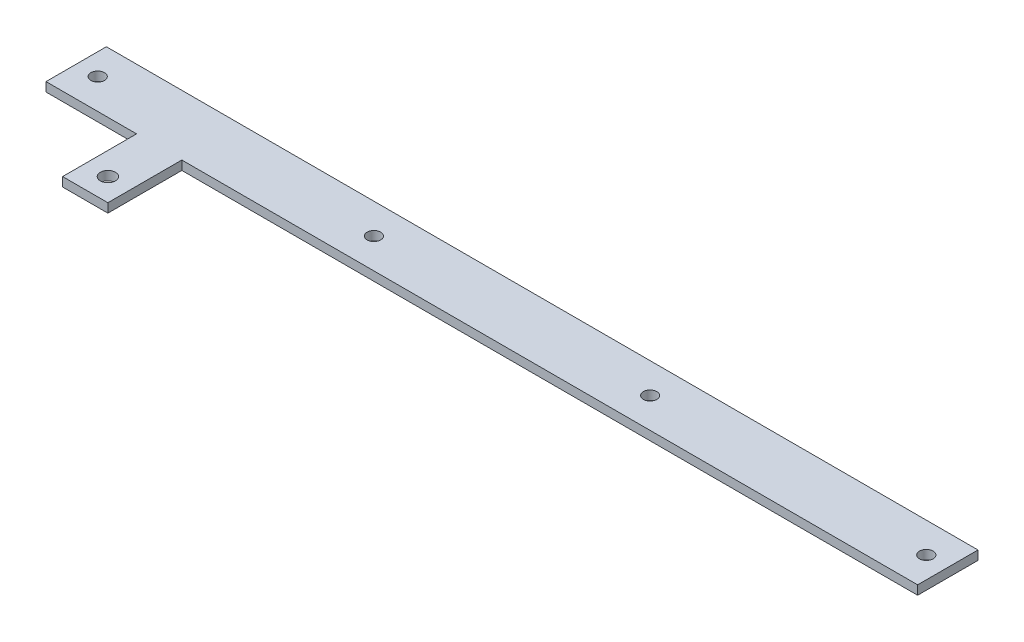
ISO-10303-21;
HEADER;
FILE_DESCRIPTION(('STEP AP214'),'2;1');
FILE_NAME('part.step','',(''),(''),'','','');
FILE_SCHEMA(('AUTOMOTIVE_DESIGN { 1 0 10303 214 1 1 1 1 }'));
ENDSEC;
DATA;
#1=APPLICATION_CONTEXT('core data for automotive mechanical design processes');
#2=APPLICATION_PROTOCOL_DEFINITION('international standard','automotive_design',2000,#1);
#3=PRODUCT_CONTEXT('',#1,'mechanical');
#4=PRODUCT('Part','Part','',(#3));
#5=PRODUCT_RELATED_PRODUCT_CATEGORY('part','',(#4));
#6=PRODUCT_DEFINITION_FORMATION('','',#4);
#7=PRODUCT_DEFINITION_CONTEXT('part definition',#1,'design');
#8=PRODUCT_DEFINITION('design','',#6,#7);
#9=PRODUCT_DEFINITION_SHAPE('','',#8);
#10=(LENGTH_UNIT() NAMED_UNIT(*) SI_UNIT(.MILLI.,.METRE.));
#11=(NAMED_UNIT(*) PLANE_ANGLE_UNIT() SI_UNIT($,.RADIAN.));
#12=(NAMED_UNIT(*) SI_UNIT($,.STERADIAN.) SOLID_ANGLE_UNIT());
#13=UNCERTAINTY_MEASURE_WITH_UNIT(LENGTH_MEASURE(1.E-05),#10,'distance_accuracy_value','');
#14=(GEOMETRIC_REPRESENTATION_CONTEXT(3) GLOBAL_UNCERTAINTY_ASSIGNED_CONTEXT((#13)) GLOBAL_UNIT_ASSIGNED_CONTEXT((#10,
#11,#12)) REPRESENTATION_CONTEXT('',''));
#15=CARTESIAN_POINT('',(0.,0.,0.));
#16=DIRECTION('',(0.,0.,1.));
#17=DIRECTION('',(1.,0.,0.));
#18=AXIS2_PLACEMENT_3D('',#15,#16,#17);
#19=CARTESIAN_POINT('',(-577.5,12.,40.));
#20=DIRECTION('',(0.,0.,-1.));
#21=DIRECTION('',(-1.,0.,0.));
#22=AXIS2_PLACEMENT_3D('',#19,#20,#21);
#23=PLANE('',#22);
#24=DIRECTION('',(0.,1.,0.));
#25=VECTOR('',#24,1.);
#26=CARTESIAN_POINT('',(-397.5,0.,40.));
#27=LINE('',#26,#25);
#28=CARTESIAN_POINT('',(-397.5,0.,40.));
#29=VERTEX_POINT('',#28);
#30=CARTESIAN_POINT('',(-397.5,12.,40.));
#31=VERTEX_POINT('',#30);
#32=EDGE_CURVE('E144',#29,#31,#27,.T.);
#33=ORIENTED_EDGE('',*,*,#32,.F.);
#34=DIRECTION('',(1.,0.,0.));
#35=VECTOR('',#34,1.);
#36=CARTESIAN_POINT('',(-577.5,0.,40.));
#37=LINE('',#36,#35);
#38=CARTESIAN_POINT('',(577.5,0.,40.));
#39=VERTEX_POINT('',#38);
#40=EDGE_CURVE('E79',#29,#39,#37,.T.);
#41=ORIENTED_EDGE('',*,*,#40,.T.);
#42=DIRECTION('',(0.,-1.,0.));
#43=VECTOR('',#42,1.);
#44=CARTESIAN_POINT('',(577.5,12.,40.));
#45=LINE('',#44,#43);
#46=CARTESIAN_POINT('',(577.5,12.,40.));
#47=VERTEX_POINT('',#46);
#48=EDGE_CURVE('E168',#47,#39,#45,.T.);
#49=ORIENTED_EDGE('',*,*,#48,.F.);
#50=DIRECTION('',(1.,0.,0.));
#51=VECTOR('',#50,1.);
#52=CARTESIAN_POINT('',(-577.5,12.,40.));
#53=LINE('',#52,#51);
#54=EDGE_CURVE('E57',#31,#47,#53,.T.);
#55=ORIENTED_EDGE('',*,*,#54,.F.);
#56=EDGE_LOOP('',(#33,#41,#49,#55));
#57=FACE_BOUND('',#56,.T.);
#58=ADVANCED_FACE('F33',(#57),#23,.F.);
#59=CARTESIAN_POINT('',(549.,0.,0.));
#60=DIRECTION('',(0.,1.,0.));
#61=DIRECTION('',(0.,0.,1.));
#62=AXIS2_PLACEMENT_3D('',#59,#60,#61);
#63=CYLINDRICAL_SURFACE('',#62,9.00000000000004);
#64=CARTESIAN_POINT('',(549.,0.,0.));
#65=DIRECTION('',(0.,1.,0.));
#66=DIRECTION('',(0.,0.,1.));
#67=AXIS2_PLACEMENT_3D('',#64,#65,#66);
#68=CIRCLE('',#67,9.00000000000004);
#69=CARTESIAN_POINT('',(549.,0.,9.00000000000004));
#70=VERTEX_POINT('',#69);
#71=EDGE_CURVE('E41',#70,#70,#68,.T.);
#72=ORIENTED_EDGE('',*,*,#71,.F.);
#73=EDGE_LOOP('',(#72));
#74=FACE_BOUND('',#73,.T.);
#75=CARTESIAN_POINT('',(549.,12.,0.));
#76=DIRECTION('',(0.,-1.,0.));
#77=DIRECTION('',(0.,0.,-1.));
#78=AXIS2_PLACEMENT_3D('',#75,#76,#77);
#79=CIRCLE('',#78,9.00000000000004);
#80=CARTESIAN_POINT('',(549.,12.,-9.00000000000003));
#81=VERTEX_POINT('',#80);
#82=EDGE_CURVE('E11',#81,#81,#79,.T.);
#83=ORIENTED_EDGE('',*,*,#82,.F.);
#84=EDGE_LOOP('',(#83));
#85=FACE_BOUND('',#84,.T.);
#86=ADVANCED_FACE('F35',(#74,#85),#63,.F.);
#87=CARTESIAN_POINT('',(183.,0.,0.));
#88=DIRECTION('',(0.,1.,0.));
#89=DIRECTION('',(0.,0.,1.));
#90=AXIS2_PLACEMENT_3D('',#87,#88,#89);
#91=CYLINDRICAL_SURFACE('',#90,9.00000000000004);
#92=CARTESIAN_POINT('',(183.,0.,0.));
#93=DIRECTION('',(0.,1.,0.));
#94=DIRECTION('',(0.,0.,1.));
#95=AXIS2_PLACEMENT_3D('',#92,#93,#94);
#96=CIRCLE('',#95,9.00000000000004);
#97=CARTESIAN_POINT('',(183.,0.,9.00000000000004));
#98=VERTEX_POINT('',#97);
#99=EDGE_CURVE('E185',#98,#98,#96,.T.);
#100=ORIENTED_EDGE('',*,*,#99,.F.);
#101=EDGE_LOOP('',(#100));
#102=FACE_BOUND('',#101,.T.);
#103=CARTESIAN_POINT('',(183.,12.,0.));
#104=DIRECTION('',(0.,-1.,0.));
#105=DIRECTION('',(0.,0.,-1.));
#106=AXIS2_PLACEMENT_3D('',#103,#104,#105);
#107=CIRCLE('',#106,9.00000000000004);
#108=CARTESIAN_POINT('',(183.,12.,-9.00000000000003));
#109=VERTEX_POINT('',#108);
#110=EDGE_CURVE('E188',#109,#109,#107,.T.);
#111=ORIENTED_EDGE('',*,*,#110,.F.);
#112=EDGE_LOOP('',(#111));
#113=FACE_BOUND('',#112,.T.);
#114=ADVANCED_FACE('F197',(#102,#113),#91,.F.);
#115=CARTESIAN_POINT('',(577.5,12.,40.));
#116=DIRECTION('',(-1.,0.,0.));
#117=DIRECTION('',(0.,0.,1.));
#118=AXIS2_PLACEMENT_3D('',#115,#116,#117);
#119=PLANE('',#118);
#120=DIRECTION('',(0.,0.,-1.));
#121=VECTOR('',#120,1.);
#122=CARTESIAN_POINT('',(577.5,0.,40.));
#123=LINE('',#122,#121);
#124=CARTESIAN_POINT('',(577.5,0.,-40.));
#125=VERTEX_POINT('',#124);
#126=EDGE_CURVE('E158',#39,#125,#123,.T.);
#127=ORIENTED_EDGE('',*,*,#126,.T.);
#128=DIRECTION('',(0.,-1.,0.));
#129=VECTOR('',#128,1.);
#130=CARTESIAN_POINT('',(577.5,12.,-40.));
#131=LINE('',#130,#129);
#132=CARTESIAN_POINT('',(577.5,12.,-40.));
#133=VERTEX_POINT('',#132);
#134=EDGE_CURVE('E183',#133,#125,#131,.T.);
#135=ORIENTED_EDGE('',*,*,#134,.F.);
#136=DIRECTION('',(0.,0.,-1.));
#137=VECTOR('',#136,1.);
#138=CARTESIAN_POINT('',(577.5,12.,40.));
#139=LINE('',#138,#137);
#140=EDGE_CURVE('E159',#47,#133,#139,.T.);
#141=ORIENTED_EDGE('',*,*,#140,.F.);
#142=ORIENTED_EDGE('',*,*,#48,.T.);
#143=EDGE_LOOP('',(#127,#135,#141,#142));
#144=FACE_BOUND('',#143,.T.);
#145=ADVANCED_FACE('F242',(#144),#119,.F.);
#146=CARTESIAN_POINT('',(-577.5,12.,-40.));
#147=DIRECTION('',(0.,0.,1.));
#148=DIRECTION('',(1.,0.,0.));
#149=AXIS2_PLACEMENT_3D('',#146,#147,#148);
#150=PLANE('',#149);
#151=DIRECTION('',(-1.,0.,0.));
#152=VECTOR('',#151,1.);
#153=CARTESIAN_POINT('',(-577.5,0.,-40.));
#154=LINE('',#153,#152);
#155=CARTESIAN_POINT('',(-577.5,0.,-40.));
#156=VERTEX_POINT('',#155);
#157=EDGE_CURVE('E171',#125,#156,#154,.T.);
#158=ORIENTED_EDGE('',*,*,#157,.T.);
#159=DIRECTION('',(0.,-1.,0.));
#160=VECTOR('',#159,1.);
#161=CARTESIAN_POINT('',(-577.5,12.,-40.));
#162=LINE('',#161,#160);
#163=CARTESIAN_POINT('',(-577.5,12.,-40.));
#164=VERTEX_POINT('',#163);
#165=EDGE_CURVE('E180',#164,#156,#162,.T.);
#166=ORIENTED_EDGE('',*,*,#165,.F.);
#167=DIRECTION('',(-1.,0.,0.));
#168=VECTOR('',#167,1.);
#169=CARTESIAN_POINT('',(-577.5,12.,-40.));
#170=LINE('',#169,#168);
#171=EDGE_CURVE('E87',#133,#164,#170,.T.);
#172=ORIENTED_EDGE('',*,*,#171,.F.);
#173=ORIENTED_EDGE('',*,*,#134,.T.);
#174=EDGE_LOOP('',(#158,#166,#172,#173));
#175=FACE_BOUND('',#174,.T.);
#176=ADVANCED_FACE('F233',(#175),#150,.F.);
#177=CARTESIAN_POINT('',(-577.5,12.,40.));
#178=DIRECTION('',(1.,0.,0.));
#179=DIRECTION('',(0.,0.,-1.));
#180=AXIS2_PLACEMENT_3D('',#177,#178,#179);
#181=PLANE('',#180);
#182=DIRECTION('',(0.,0.,1.));
#183=VECTOR('',#182,1.);
#184=CARTESIAN_POINT('',(-577.5,0.,40.));
#185=LINE('',#184,#183);
#186=CARTESIAN_POINT('',(-577.5,0.,40.));
#187=VERTEX_POINT('',#186);
#188=EDGE_CURVE('E173',#156,#187,#185,.T.);
#189=ORIENTED_EDGE('',*,*,#188,.T.);
#190=DIRECTION('',(0.,-1.,0.));
#191=VECTOR('',#190,1.);
#192=CARTESIAN_POINT('',(-577.5,12.,40.));
#193=LINE('',#192,#191);
#194=CARTESIAN_POINT('',(-577.5,12.,40.));
#195=VERTEX_POINT('',#194);
#196=EDGE_CURVE('E177',#195,#187,#193,.T.);
#197=ORIENTED_EDGE('',*,*,#196,.F.);
#198=DIRECTION('',(0.,0.,1.));
#199=VECTOR('',#198,1.);
#200=CARTESIAN_POINT('',(-577.5,12.,40.));
#201=LINE('',#200,#199);
#202=EDGE_CURVE('E163',#164,#195,#201,.T.);
#203=ORIENTED_EDGE('',*,*,#202,.F.);
#204=ORIENTED_EDGE('',*,*,#165,.T.);
#205=EDGE_LOOP('',(#189,#197,#203,#204));
#206=FACE_BOUND('',#205,.T.);
#207=ADVANCED_FACE('F228',(#206),#181,.F.);
#208=CARTESIAN_POINT('',(-457.5,0.,40.));
#209=VERTEX_POINT('',#208);
#210=EDGE_CURVE('E161',#187,#209,#37,.T.);
#211=ORIENTED_EDGE('',*,*,#210,.T.);
#212=DIRECTION('',(0.,1.,0.));
#213=VECTOR('',#212,1.);
#214=CARTESIAN_POINT('',(-457.5,0.,40.));
#215=LINE('',#214,#213);
#216=CARTESIAN_POINT('',(-457.5,12.,40.));
#217=VERTEX_POINT('',#216);
#218=EDGE_CURVE('E130',#209,#217,#215,.T.);
#219=ORIENTED_EDGE('',*,*,#218,.T.);
#220=EDGE_CURVE('E165',#195,#217,#53,.T.);
#221=ORIENTED_EDGE('',*,*,#220,.F.);
#222=ORIENTED_EDGE('',*,*,#196,.T.);
#223=EDGE_LOOP('',(#211,#219,#221,#222));
#224=FACE_BOUND('',#223,.T.);
#225=ADVANCED_FACE('F203',(#224),#23,.F.);
#226=CARTESIAN_POINT('',(0.,12.,0.));
#227=DIRECTION('',(0.,-1.,0.));
#228=DIRECTION('',(0.,0.,-1.));
#229=AXIS2_PLACEMENT_3D('',#226,#227,#228);
#230=PLANE('',#229);
#231=CARTESIAN_POINT('',(-183.,12.,0.));
#232=DIRECTION('',(0.,-1.,0.));
#233=DIRECTION('',(0.,0.,-1.));
#234=AXIS2_PLACEMENT_3D('',#231,#232,#233);
#235=CIRCLE('',#234,9.00000000000004);
#236=CARTESIAN_POINT('',(-183.,12.,-9.00000000000003));
#237=VERTEX_POINT('',#236);
#238=EDGE_CURVE('E149',#237,#237,#235,.T.);
#239=ORIENTED_EDGE('',*,*,#238,.T.);
#240=EDGE_LOOP('',(#239));
#241=FACE_BOUND('',#240,.T.);
#242=CARTESIAN_POINT('',(-549.,12.,0.));
#243=DIRECTION('',(0.,-1.,0.));
#244=DIRECTION('',(0.,0.,-1.));
#245=AXIS2_PLACEMENT_3D('',#242,#243,#244);
#246=CIRCLE('',#245,9.00000000000004);
#247=CARTESIAN_POINT('',(-549.,12.,-9.00000000000003));
#248=VERTEX_POINT('',#247);
#249=EDGE_CURVE('E155',#248,#248,#246,.T.);
#250=ORIENTED_EDGE('',*,*,#249,.T.);
#251=EDGE_LOOP('',(#250));
#252=FACE_BOUND('',#251,.T.);
#253=ORIENTED_EDGE('',*,*,#140,.T.);
#254=ORIENTED_EDGE('',*,*,#171,.T.);
#255=ORIENTED_EDGE('',*,*,#202,.T.);
#256=ORIENTED_EDGE('',*,*,#220,.T.);
#257=DIRECTION('',(0.,0.,1.));
#258=VECTOR('',#257,1.);
#259=CARTESIAN_POINT('',(-457.5,12.,40.));
#260=LINE('',#259,#258);
#261=CARTESIAN_POINT('',(-457.5,12.,138.));
#262=VERTEX_POINT('',#261);
#263=EDGE_CURVE('E48',#217,#262,#260,.T.);
#264=ORIENTED_EDGE('',*,*,#263,.T.);
#265=DIRECTION('',(1.,0.,0.));
#266=VECTOR('',#265,1.);
#267=CARTESIAN_POINT('',(-457.5,12.,138.));
#268=LINE('',#267,#266);
#269=CARTESIAN_POINT('',(-397.5,12.,138.));
#270=VERTEX_POINT('',#269);
#271=EDGE_CURVE('E114',#262,#270,#268,.T.);
#272=ORIENTED_EDGE('',*,*,#271,.T.);
#273=DIRECTION('',(0.,0.,-1.));
#274=VECTOR('',#273,1.);
#275=CARTESIAN_POINT('',(-397.5,12.,40.));
#276=LINE('',#275,#274);
#277=EDGE_CURVE('E131',#270,#31,#276,.T.);
#278=ORIENTED_EDGE('',*,*,#277,.T.);
#279=ORIENTED_EDGE('',*,*,#54,.T.);
#280=EDGE_LOOP('',(#253,#254,#255,#256,#264,#272,#278,#279));
#281=FACE_BOUND('',#280,.T.);
#282=ORIENTED_EDGE('',*,*,#110,.T.);
#283=EDGE_LOOP('',(#282));
#284=FACE_BOUND('',#283,.T.);
#285=ORIENTED_EDGE('',*,*,#82,.T.);
#286=EDGE_LOOP('',(#285));
#287=FACE_BOUND('',#286,.T.);
#288=CARTESIAN_POINT('',(-427.5,12.,108.));
#289=DIRECTION('',(0.,1.,0.));
#290=DIRECTION('',(0.,0.,1.));
#291=AXIS2_PLACEMENT_3D('',#288,#289,#290);
#292=CIRCLE('',#291,9.99999999999998);
#293=CARTESIAN_POINT('',(-427.5,12.,118.));
#294=VERTEX_POINT('',#293);
#295=EDGE_CURVE('E135',#294,#294,#292,.T.);
#296=ORIENTED_EDGE('',*,*,#295,.F.);
#297=EDGE_LOOP('',(#296));
#298=FACE_BOUND('',#297,.T.);
#299=ADVANCED_FACE('F200',(#241,#252,#281,#284,#287,#298),#230,.F.);
#300=CARTESIAN_POINT('',(0.,0.,0.));
#301=DIRECTION('',(0.,-1.,0.));
#302=DIRECTION('',(0.,0.,-1.));
#303=AXIS2_PLACEMENT_3D('',#300,#301,#302);
#304=PLANE('',#303);
#305=CARTESIAN_POINT('',(-183.,0.,0.));
#306=DIRECTION('',(0.,1.,0.));
#307=DIRECTION('',(0.,0.,1.));
#308=AXIS2_PLACEMENT_3D('',#305,#306,#307);
#309=CIRCLE('',#308,9.00000000000004);
#310=CARTESIAN_POINT('',(-183.,0.,9.00000000000004));
#311=VERTEX_POINT('',#310);
#312=EDGE_CURVE('E143',#311,#311,#309,.T.);
#313=ORIENTED_EDGE('',*,*,#312,.T.);
#314=EDGE_LOOP('',(#313));
#315=FACE_BOUND('',#314,.T.);
#316=CARTESIAN_POINT('',(-549.,0.,0.));
#317=DIRECTION('',(0.,1.,0.));
#318=DIRECTION('',(0.,0.,1.));
#319=AXIS2_PLACEMENT_3D('',#316,#317,#318);
#320=CIRCLE('',#319,9.00000000000004);
#321=CARTESIAN_POINT('',(-549.,0.,9.00000000000004));
#322=VERTEX_POINT('',#321);
#323=EDGE_CURVE('E152',#322,#322,#320,.T.);
#324=ORIENTED_EDGE('',*,*,#323,.T.);
#325=EDGE_LOOP('',(#324));
#326=FACE_BOUND('',#325,.T.);
#327=ORIENTED_EDGE('',*,*,#126,.F.);
#328=ORIENTED_EDGE('',*,*,#40,.F.);
#329=DIRECTION('',(0.,0.,-1.));
#330=VECTOR('',#329,1.);
#331=CARTESIAN_POINT('',(-397.5,0.,40.));
#332=LINE('',#331,#330);
#333=CARTESIAN_POINT('',(-397.5,0.,138.));
#334=VERTEX_POINT('',#333);
#335=EDGE_CURVE('E117',#334,#29,#332,.T.);
#336=ORIENTED_EDGE('',*,*,#335,.F.);
#337=DIRECTION('',(1.,0.,0.));
#338=VECTOR('',#337,1.);
#339=CARTESIAN_POINT('',(-457.5,0.,138.));
#340=LINE('',#339,#338);
#341=CARTESIAN_POINT('',(-457.5,0.,138.));
#342=VERTEX_POINT('',#341);
#343=EDGE_CURVE('E112',#342,#334,#340,.T.);
#344=ORIENTED_EDGE('',*,*,#343,.F.);
#345=DIRECTION('',(0.,0.,1.));
#346=VECTOR('',#345,1.);
#347=CARTESIAN_POINT('',(-457.5,0.,40.));
#348=LINE('',#347,#346);
#349=EDGE_CURVE('E126',#209,#342,#348,.T.);
#350=ORIENTED_EDGE('',*,*,#349,.F.);
#351=ORIENTED_EDGE('',*,*,#210,.F.);
#352=ORIENTED_EDGE('',*,*,#188,.F.);
#353=ORIENTED_EDGE('',*,*,#157,.F.);
#354=EDGE_LOOP('',(#327,#328,#336,#344,#350,#351,#352,#353));
#355=FACE_BOUND('',#354,.T.);
#356=ORIENTED_EDGE('',*,*,#99,.T.);
#357=EDGE_LOOP('',(#356));
#358=FACE_BOUND('',#357,.T.);
#359=ORIENTED_EDGE('',*,*,#71,.T.);
#360=EDGE_LOOP('',(#359));
#361=FACE_BOUND('',#360,.T.);
#362=CARTESIAN_POINT('',(-427.5,0.,108.));
#363=DIRECTION('',(0.,1.,0.));
#364=DIRECTION('',(0.,0.,1.));
#365=AXIS2_PLACEMENT_3D('',#362,#363,#364);
#366=CIRCLE('',#365,9.99999999999998);
#367=CARTESIAN_POINT('',(-427.5,0.,118.));
#368=VERTEX_POINT('',#367);
#369=EDGE_CURVE('E140',#368,#368,#366,.T.);
#370=ORIENTED_EDGE('',*,*,#369,.T.);
#371=EDGE_LOOP('',(#370));
#372=FACE_BOUND('',#371,.T.);
#373=ADVANCED_FACE('F123',(#315,#326,#355,#358,#361,#372),#304,.T.);
#374=CARTESIAN_POINT('',(-549.,0.,0.));
#375=DIRECTION('',(0.,1.,0.));
#376=DIRECTION('',(0.,0.,1.));
#377=AXIS2_PLACEMENT_3D('',#374,#375,#376);
#378=CYLINDRICAL_SURFACE('',#377,9.00000000000004);
#379=ORIENTED_EDGE('',*,*,#323,.F.);
#380=EDGE_LOOP('',(#379));
#381=FACE_BOUND('',#380,.T.);
#382=ORIENTED_EDGE('',*,*,#249,.F.);
#383=EDGE_LOOP('',(#382));
#384=FACE_BOUND('',#383,.T.);
#385=ADVANCED_FACE('F271',(#381,#384),#378,.F.);
#386=CARTESIAN_POINT('',(-183.,0.,0.));
#387=DIRECTION('',(0.,1.,0.));
#388=DIRECTION('',(0.,0.,1.));
#389=AXIS2_PLACEMENT_3D('',#386,#387,#388);
#390=CYLINDRICAL_SURFACE('',#389,9.00000000000004);
#391=ORIENTED_EDGE('',*,*,#312,.F.);
#392=EDGE_LOOP('',(#391));
#393=FACE_BOUND('',#392,.T.);
#394=ORIENTED_EDGE('',*,*,#238,.F.);
#395=EDGE_LOOP('',(#394));
#396=FACE_BOUND('',#395,.T.);
#397=ADVANCED_FACE('F276',(#393,#396),#390,.F.);
#398=CARTESIAN_POINT('',(-457.5,0.,40.));
#399=DIRECTION('',(-1.,0.,0.));
#400=DIRECTION('',(0.,0.,1.));
#401=AXIS2_PLACEMENT_3D('',#398,#399,#400);
#402=PLANE('',#401);
#403=ORIENTED_EDGE('',*,*,#263,.F.);
#404=ORIENTED_EDGE('',*,*,#218,.F.);
#405=ORIENTED_EDGE('',*,*,#349,.T.);
#406=DIRECTION('',(0.,1.,0.));
#407=VECTOR('',#406,1.);
#408=CARTESIAN_POINT('',(-457.5,0.,138.));
#409=LINE('',#408,#407);
#410=EDGE_CURVE('E109',#342,#262,#409,.T.);
#411=ORIENTED_EDGE('',*,*,#410,.T.);
#412=EDGE_LOOP('',(#403,#404,#405,#411));
#413=FACE_BOUND('',#412,.T.);
#414=ADVANCED_FACE('F129',(#413),#402,.T.);
#415=CARTESIAN_POINT('',(-397.5,0.,40.));
#416=DIRECTION('',(1.,0.,0.));
#417=DIRECTION('',(0.,0.,-1.));
#418=AXIS2_PLACEMENT_3D('',#415,#416,#417);
#419=PLANE('',#418);
#420=ORIENTED_EDGE('',*,*,#277,.F.);
#421=DIRECTION('',(0.,1.,0.));
#422=VECTOR('',#421,1.);
#423=CARTESIAN_POINT('',(-397.5,0.,138.));
#424=LINE('',#423,#422);
#425=EDGE_CURVE('E116',#334,#270,#424,.T.);
#426=ORIENTED_EDGE('',*,*,#425,.F.);
#427=ORIENTED_EDGE('',*,*,#335,.T.);
#428=ORIENTED_EDGE('',*,*,#32,.T.);
#429=EDGE_LOOP('',(#420,#426,#427,#428));
#430=FACE_BOUND('',#429,.T.);
#431=ADVANCED_FACE('F218',(#430),#419,.T.);
#432=CARTESIAN_POINT('',(-457.5,0.,138.));
#433=DIRECTION('',(0.,0.,1.));
#434=DIRECTION('',(1.,0.,0.));
#435=AXIS2_PLACEMENT_3D('',#432,#433,#434);
#436=PLANE('',#435);
#437=ORIENTED_EDGE('',*,*,#271,.F.);
#438=ORIENTED_EDGE('',*,*,#410,.F.);
#439=ORIENTED_EDGE('',*,*,#343,.T.);
#440=ORIENTED_EDGE('',*,*,#425,.T.);
#441=EDGE_LOOP('',(#437,#438,#439,#440));
#442=FACE_BOUND('',#441,.T.);
#443=ADVANCED_FACE('F111',(#442),#436,.T.);
#444=CARTESIAN_POINT('',(-427.5,0.,108.));
#445=DIRECTION('',(0.,1.,0.));
#446=DIRECTION('',(0.,0.,1.));
#447=AXIS2_PLACEMENT_3D('',#444,#445,#446);
#448=CYLINDRICAL_SURFACE('',#447,9.99999999999998);
#449=ORIENTED_EDGE('',*,*,#369,.F.);
#450=EDGE_LOOP('',(#449));
#451=FACE_BOUND('',#450,.T.);
#452=ORIENTED_EDGE('',*,*,#295,.T.);
#453=EDGE_LOOP('',(#452));
#454=FACE_BOUND('',#453,.T.);
#455=ADVANCED_FACE('F212',(#451,#454),#448,.F.);
#456=CLOSED_SHELL('',(#58,#86,#114,#145,#176,#207,#225,#299,#373,#385,#397,#414,#431,#443,#455));
#457=MANIFOLD_SOLID_BREP('B2',#456);
#458=ADVANCED_BREP_SHAPE_REPRESENTATION('',(#18,#457),#14);
#459=SHAPE_DEFINITION_REPRESENTATION(#9,#458);
ENDSEC;
END-ISO-10303-21;
